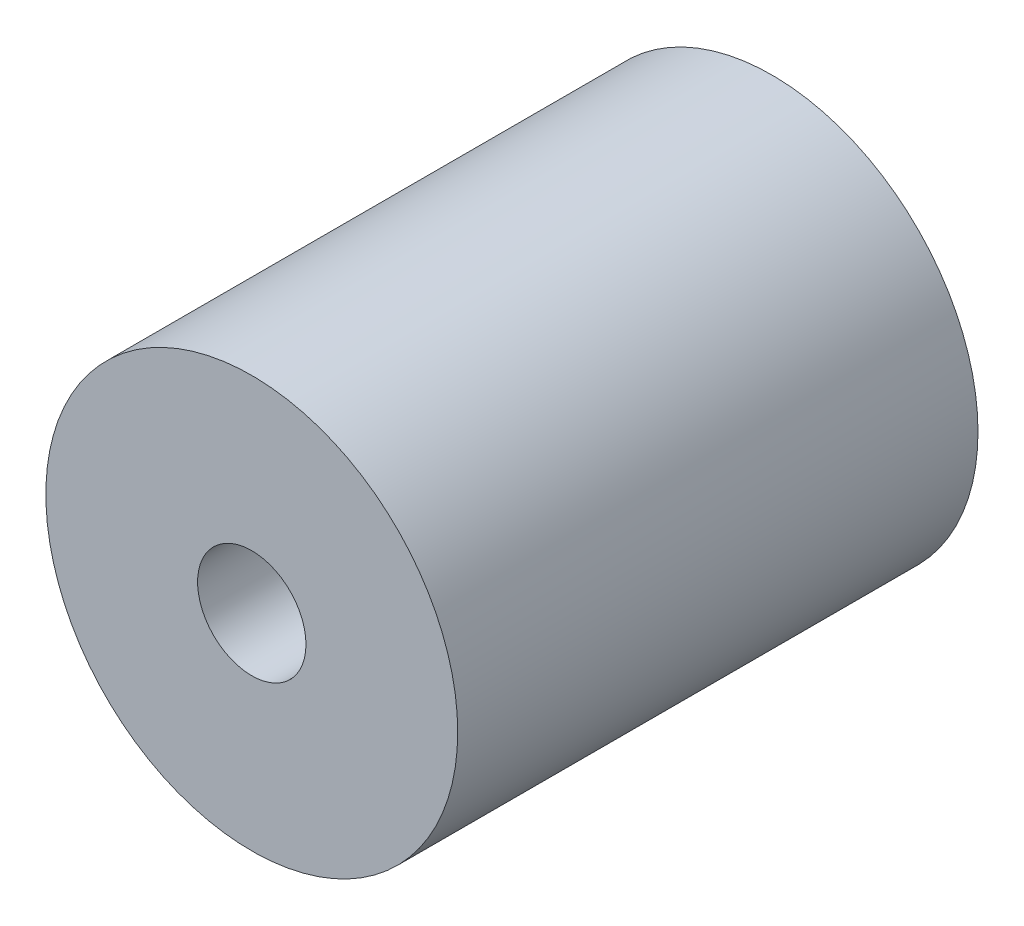
ISO-10303-21;
HEADER;
FILE_DESCRIPTION(('STEP AP214'),'2;1');
FILE_NAME('part.step','',(''),(''),'','','');
FILE_SCHEMA(('AUTOMOTIVE_DESIGN { 1 0 10303 214 1 1 1 1 }'));
ENDSEC;
DATA;
#1=APPLICATION_CONTEXT('core data for automotive mechanical design processes');
#2=APPLICATION_PROTOCOL_DEFINITION('international standard','automotive_design',2000,#1);
#3=PRODUCT_CONTEXT('',#1,'mechanical');
#4=PRODUCT('Part','Part','',(#3));
#5=PRODUCT_RELATED_PRODUCT_CATEGORY('part','',(#4));
#6=PRODUCT_DEFINITION_FORMATION('','',#4);
#7=PRODUCT_DEFINITION_CONTEXT('part definition',#1,'design');
#8=PRODUCT_DEFINITION('design','',#6,#7);
#9=PRODUCT_DEFINITION_SHAPE('','',#8);
#10=(LENGTH_UNIT() NAMED_UNIT(*) SI_UNIT(.MILLI.,.METRE.));
#11=(NAMED_UNIT(*) PLANE_ANGLE_UNIT() SI_UNIT($,.RADIAN.));
#12=(NAMED_UNIT(*) SI_UNIT($,.STERADIAN.) SOLID_ANGLE_UNIT());
#13=UNCERTAINTY_MEASURE_WITH_UNIT(LENGTH_MEASURE(1.E-05),#10,'distance_accuracy_value','');
#14=(GEOMETRIC_REPRESENTATION_CONTEXT(3) GLOBAL_UNCERTAINTY_ASSIGNED_CONTEXT((#13)) GLOBAL_UNIT_ASSIGNED_CONTEXT((#10,
#11,#12)) REPRESENTATION_CONTEXT('',''));
#15=CARTESIAN_POINT('',(0.,0.,0.));
#16=DIRECTION('',(0.,0.,1.));
#17=DIRECTION('',(1.,0.,0.));
#18=AXIS2_PLACEMENT_3D('',#15,#16,#17);
#19=CARTESIAN_POINT('',(0.,0.,24.));
#20=DIRECTION('',(0.,0.,-1.));
#21=DIRECTION('',(-1.,0.,0.));
#22=AXIS2_PLACEMENT_3D('',#19,#20,#21);
#23=CYLINDRICAL_SURFACE('',#22,4.);
#24=CARTESIAN_POINT('',(0.,0.,0.));
#25=DIRECTION('',(0.,0.,1.));
#26=DIRECTION('',(1.,0.,0.));
#27=AXIS2_PLACEMENT_3D('',#24,#25,#26);
#28=CIRCLE('',#27,4.);
#29=CARTESIAN_POINT('',(4.,0.,0.));
#30=VERTEX_POINT('',#29);
#31=EDGE_CURVE('E42',#30,#30,#28,.T.);
#32=ORIENTED_EDGE('',*,*,#31,.F.);
#33=EDGE_LOOP('',(#32));
#34=FACE_BOUND('',#33,.T.);
#35=CARTESIAN_POINT('',(0.,0.,12.));
#36=DIRECTION('',(0.,0.,1.));
#37=DIRECTION('',(1.,0.,0.));
#38=AXIS2_PLACEMENT_3D('',#35,#36,#37);
#39=CIRCLE('',#38,4.);
#40=CARTESIAN_POINT('',(4.,0.,12.));
#41=VERTEX_POINT('',#40);
#42=EDGE_CURVE('E46',#41,#41,#39,.T.);
#43=ORIENTED_EDGE('',*,*,#42,.T.);
#44=EDGE_LOOP('',(#43));
#45=FACE_BOUND('',#44,.T.);
#46=ADVANCED_FACE('F31',(#34,#45),#23,.F.);
#47=CARTESIAN_POINT('',(0.,0.,24.));
#48=DIRECTION('',(0.,0.,1.));
#49=DIRECTION('',(1.,0.,0.));
#50=AXIS2_PLACEMENT_3D('',#47,#48,#49);
#51=PLANE('',#50);
#52=CARTESIAN_POINT('',(0.,0.,24.));
#53=DIRECTION('',(0.,0.,1.));
#54=DIRECTION('',(1.,0.,0.));
#55=AXIS2_PLACEMENT_3D('',#52,#53,#54);
#56=CIRCLE('',#55,9.5);
#57=CARTESIAN_POINT('',(9.5,0.,24.));
#58=VERTEX_POINT('',#57);
#59=EDGE_CURVE('E10',#58,#58,#56,.T.);
#60=ORIENTED_EDGE('',*,*,#59,.T.);
#61=EDGE_LOOP('',(#60));
#62=FACE_BOUND('',#61,.T.);
#63=CARTESIAN_POINT('',(0.,0.,24.));
#64=DIRECTION('',(0.,0.,1.));
#65=DIRECTION('',(1.,0.,0.));
#66=AXIS2_PLACEMENT_3D('',#63,#64,#65);
#67=CIRCLE('',#66,2.5);
#68=CARTESIAN_POINT('',(2.5,0.,24.));
#69=VERTEX_POINT('',#68);
#70=EDGE_CURVE('E50',#69,#69,#67,.T.);
#71=ORIENTED_EDGE('',*,*,#70,.F.);
#72=EDGE_LOOP('',(#71));
#73=FACE_BOUND('',#72,.T.);
#74=ADVANCED_FACE('F65',(#62,#73),#51,.T.);
#75=CARTESIAN_POINT('',(0.,0.,0.));
#76=DIRECTION('',(0.,0.,1.));
#77=DIRECTION('',(1.,0.,0.));
#78=AXIS2_PLACEMENT_3D('',#75,#76,#77);
#79=PLANE('',#78);
#80=CARTESIAN_POINT('',(0.,0.,0.));
#81=DIRECTION('',(0.,0.,1.));
#82=DIRECTION('',(1.,0.,0.));
#83=AXIS2_PLACEMENT_3D('',#80,#81,#82);
#84=CIRCLE('',#83,9.5);
#85=CARTESIAN_POINT('',(9.5,0.,0.));
#86=VERTEX_POINT('',#85);
#87=EDGE_CURVE('E35',#86,#86,#84,.T.);
#88=ORIENTED_EDGE('',*,*,#87,.F.);
#89=EDGE_LOOP('',(#88));
#90=FACE_BOUND('',#89,.T.);
#91=ORIENTED_EDGE('',*,*,#31,.T.);
#92=EDGE_LOOP('',(#91));
#93=FACE_BOUND('',#92,.T.);
#94=ADVANCED_FACE('F67',(#90,#93),#79,.F.);
#95=CARTESIAN_POINT('',(0.,0.,24.));
#96=DIRECTION('',(0.,0.,-1.));
#97=DIRECTION('',(-1.,0.,0.));
#98=AXIS2_PLACEMENT_3D('',#95,#96,#97);
#99=CYLINDRICAL_SURFACE('',#98,9.5);
#100=ORIENTED_EDGE('',*,*,#59,.F.);
#101=EDGE_LOOP('',(#100));
#102=FACE_BOUND('',#101,.T.);
#103=ORIENTED_EDGE('',*,*,#87,.T.);
#104=EDGE_LOOP('',(#103));
#105=FACE_BOUND('',#104,.T.);
#106=ADVANCED_FACE('F33',(#102,#105),#99,.T.);
#107=CARTESIAN_POINT('',(0.,0.,12.));
#108=DIRECTION('',(0.,0.,1.));
#109=DIRECTION('',(1.,0.,0.));
#110=AXIS2_PLACEMENT_3D('',#107,#108,#109);
#111=PLANE('',#110);
#112=CARTESIAN_POINT('',(0.,0.,12.));
#113=DIRECTION('',(0.,0.,1.));
#114=DIRECTION('',(1.,0.,0.));
#115=AXIS2_PLACEMENT_3D('',#112,#113,#114);
#116=CIRCLE('',#115,2.5);
#117=CARTESIAN_POINT('',(2.5,0.,12.));
#118=VERTEX_POINT('',#117);
#119=EDGE_CURVE('E49',#118,#118,#116,.T.);
#120=ORIENTED_EDGE('',*,*,#119,.T.);
#121=EDGE_LOOP('',(#120));
#122=FACE_BOUND('',#121,.T.);
#123=ORIENTED_EDGE('',*,*,#42,.F.);
#124=EDGE_LOOP('',(#123));
#125=FACE_BOUND('',#124,.T.);
#126=ADVANCED_FACE('F56',(#122,#125),#111,.F.);
#127=CARTESIAN_POINT('',(0.,0.,12.));
#128=DIRECTION('',(0.,0.,1.));
#129=DIRECTION('',(1.,0.,0.));
#130=AXIS2_PLACEMENT_3D('',#127,#128,#129);
#131=CYLINDRICAL_SURFACE('',#130,2.5);
#132=ORIENTED_EDGE('',*,*,#119,.F.);
#133=EDGE_LOOP('',(#132));
#134=FACE_BOUND('',#133,.T.);
#135=ORIENTED_EDGE('',*,*,#70,.T.);
#136=EDGE_LOOP('',(#135));
#137=FACE_BOUND('',#136,.T.);
#138=ADVANCED_FACE('F59',(#134,#137),#131,.F.);
#139=CLOSED_SHELL('',(#46,#74,#94,#106,#126,#138));
#140=MANIFOLD_SOLID_BREP('B2',#139);
#141=ADVANCED_BREP_SHAPE_REPRESENTATION('',(#18,#140),#14);
#142=SHAPE_DEFINITION_REPRESENTATION(#9,#141);
ENDSEC;
END-ISO-10303-21;
